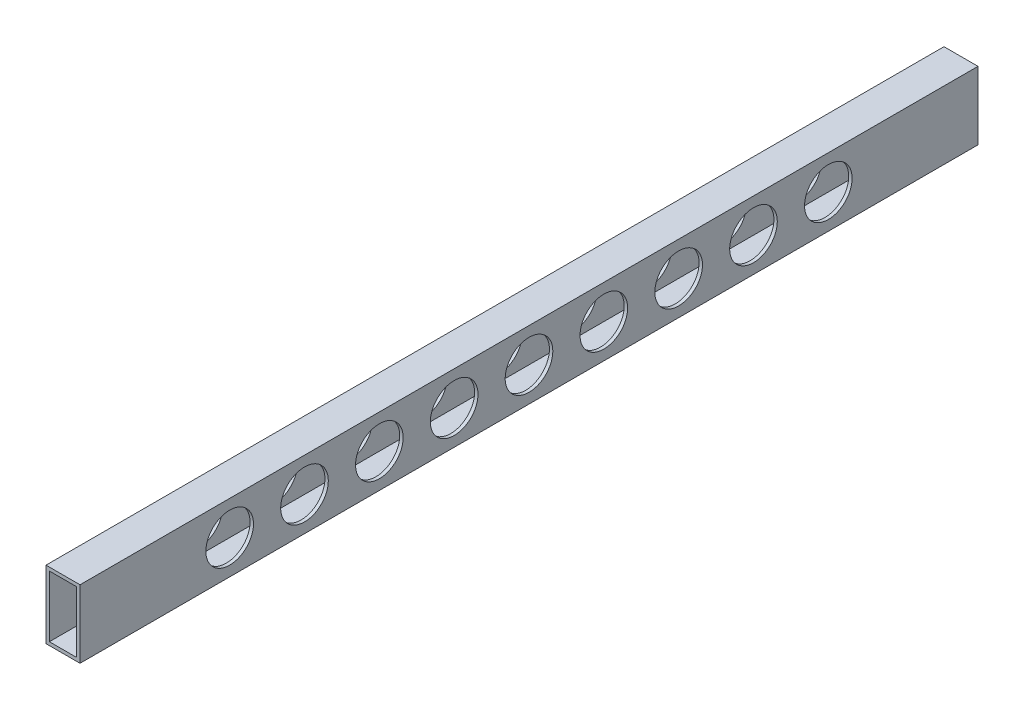
ISO-10303-21;
HEADER;
FILE_DESCRIPTION(('STEP AP214'),'2;1');
FILE_NAME('part.step','',(''),(''),'','','');
FILE_SCHEMA(('AUTOMOTIVE_DESIGN { 1 0 10303 214 1 1 1 1 }'));
ENDSEC;
DATA;
#1=APPLICATION_CONTEXT('core data for automotive mechanical design processes');
#2=APPLICATION_PROTOCOL_DEFINITION('international standard','automotive_design',2000,#1);
#3=PRODUCT_CONTEXT('',#1,'mechanical');
#4=PRODUCT('Part','Part','',(#3));
#5=PRODUCT_RELATED_PRODUCT_CATEGORY('part','',(#4));
#6=PRODUCT_DEFINITION_FORMATION('','',#4);
#7=PRODUCT_DEFINITION_CONTEXT('part definition',#1,'design');
#8=PRODUCT_DEFINITION('design','',#6,#7);
#9=PRODUCT_DEFINITION_SHAPE('','',#8);
#10=(LENGTH_UNIT() NAMED_UNIT(*) SI_UNIT(.MILLI.,.METRE.));
#11=(NAMED_UNIT(*) PLANE_ANGLE_UNIT() SI_UNIT($,.RADIAN.));
#12=(NAMED_UNIT(*) SI_UNIT($,.STERADIAN.) SOLID_ANGLE_UNIT());
#13=UNCERTAINTY_MEASURE_WITH_UNIT(LENGTH_MEASURE(1.E-05),#10,'distance_accuracy_value','');
#14=(GEOMETRIC_REPRESENTATION_CONTEXT(3) GLOBAL_UNCERTAINTY_ASSIGNED_CONTEXT((#13)) GLOBAL_UNIT_ASSIGNED_CONTEXT((#10,
#11,#12)) REPRESENTATION_CONTEXT('',''));
#15=CARTESIAN_POINT('',(0.,0.,0.));
#16=DIRECTION('',(0.,0.,1.));
#17=DIRECTION('',(1.,0.,0.));
#18=AXIS2_PLACEMENT_3D('',#15,#16,#17);
#19=CARTESIAN_POINT('',(0.,0.,838.2));
#20=DIRECTION('',(0.,0.,-1.));
#21=DIRECTION('',(-1.,0.,0.));
#22=AXIS2_PLACEMENT_3D('',#19,#20,#21);
#23=PLANE('',#22);
#24=DIRECTION('',(0.,-1.,0.));
#25=VECTOR('',#24,1.);
#26=CARTESIAN_POINT('',(0.,0.,838.2));
#27=LINE('',#26,#25);
#28=CARTESIAN_POINT('',(0.,63.5,838.2));
#29=VERTEX_POINT('',#28);
#30=CARTESIAN_POINT('',(0.,0.,838.2));
#31=VERTEX_POINT('',#30);
#32=EDGE_CURVE('E138',#29,#31,#27,.T.);
#33=ORIENTED_EDGE('',*,*,#32,.T.);
#34=DIRECTION('',(1.,0.,0.));
#35=VECTOR('',#34,1.);
#36=CARTESIAN_POINT('',(0.,0.,838.2));
#37=LINE('',#36,#35);
#38=CARTESIAN_POINT('',(31.75,0.,838.2));
#39=VERTEX_POINT('',#38);
#40=EDGE_CURVE('E141',#31,#39,#37,.T.);
#41=ORIENTED_EDGE('',*,*,#40,.T.);
#42=DIRECTION('',(0.,1.,0.));
#43=VECTOR('',#42,1.);
#44=CARTESIAN_POINT('',(31.75,0.,838.2));
#45=LINE('',#44,#43);
#46=CARTESIAN_POINT('',(31.75,63.5,838.2));
#47=VERTEX_POINT('',#46);
#48=EDGE_CURVE('E144',#39,#47,#45,.T.);
#49=ORIENTED_EDGE('',*,*,#48,.T.);
#50=DIRECTION('',(-1.,0.,0.));
#51=VECTOR('',#50,1.);
#52=CARTESIAN_POINT('',(0.,63.5,838.2));
#53=LINE('',#52,#51);
#54=EDGE_CURVE('E146',#47,#29,#53,.T.);
#55=ORIENTED_EDGE('',*,*,#54,.T.);
#56=EDGE_LOOP('',(#33,#41,#49,#55));
#57=FACE_BOUND('',#56,.T.);
#58=DIRECTION('',(0.,-1.,0.));
#59=VECTOR('',#58,1.);
#60=CARTESIAN_POINT('',(3.175,3.175,838.2));
#61=LINE('',#60,#59);
#62=CARTESIAN_POINT('',(3.175,60.325,838.2));
#63=VERTEX_POINT('',#62);
#64=CARTESIAN_POINT('',(3.175,3.175,838.2));
#65=VERTEX_POINT('',#64);
#66=EDGE_CURVE('E100',#63,#65,#61,.T.);
#67=ORIENTED_EDGE('',*,*,#66,.F.);
#68=DIRECTION('',(-1.,0.,0.));
#69=VECTOR('',#68,1.);
#70=CARTESIAN_POINT('',(3.175,60.325,838.2));
#71=LINE('',#70,#69);
#72=CARTESIAN_POINT('',(28.575,60.325,838.2));
#73=VERTEX_POINT('',#72);
#74=EDGE_CURVE('E122',#73,#63,#71,.T.);
#75=ORIENTED_EDGE('',*,*,#74,.F.);
#76=DIRECTION('',(0.,1.,0.));
#77=VECTOR('',#76,1.);
#78=CARTESIAN_POINT('',(28.575,3.175,838.2));
#79=LINE('',#78,#77);
#80=CARTESIAN_POINT('',(28.575,3.175,838.2));
#81=VERTEX_POINT('',#80);
#82=EDGE_CURVE('E120',#81,#73,#79,.T.);
#83=ORIENTED_EDGE('',*,*,#82,.F.);
#84=DIRECTION('',(1.,0.,0.));
#85=VECTOR('',#84,1.);
#86=CARTESIAN_POINT('',(3.175,3.175,838.2));
#87=LINE('',#86,#85);
#88=EDGE_CURVE('E108',#65,#81,#87,.T.);
#89=ORIENTED_EDGE('',*,*,#88,.F.);
#90=EDGE_LOOP('',(#67,#75,#83,#89));
#91=FACE_BOUND('',#90,.T.);
#92=ADVANCED_FACE('F33',(#57,#91),#23,.F.);
#93=CARTESIAN_POINT('',(0.,0.,0.));
#94=DIRECTION('',(0.,0.,-1.));
#95=DIRECTION('',(-1.,0.,0.));
#96=AXIS2_PLACEMENT_3D('',#93,#94,#95);
#97=PLANE('',#96);
#98=DIRECTION('',(0.,-1.,0.));
#99=VECTOR('',#98,1.);
#100=CARTESIAN_POINT('',(0.,0.,0.));
#101=LINE('',#100,#99);
#102=CARTESIAN_POINT('',(0.,63.5,0.));
#103=VERTEX_POINT('',#102);
#104=CARTESIAN_POINT('',(0.,0.,0.));
#105=VERTEX_POINT('',#104);
#106=EDGE_CURVE('E116',#103,#105,#101,.T.);
#107=ORIENTED_EDGE('',*,*,#106,.F.);
#108=DIRECTION('',(-1.,0.,0.));
#109=VECTOR('',#108,1.);
#110=CARTESIAN_POINT('',(0.,63.5,0.));
#111=LINE('',#110,#109);
#112=CARTESIAN_POINT('',(31.75,63.5,0.));
#113=VERTEX_POINT('',#112);
#114=EDGE_CURVE('E142',#113,#103,#111,.T.);
#115=ORIENTED_EDGE('',*,*,#114,.F.);
#116=DIRECTION('',(0.,1.,0.));
#117=VECTOR('',#116,1.);
#118=CARTESIAN_POINT('',(31.75,0.,0.));
#119=LINE('',#118,#117);
#120=CARTESIAN_POINT('',(31.75,0.,0.));
#121=VERTEX_POINT('',#120);
#122=EDGE_CURVE('E153',#121,#113,#119,.T.);
#123=ORIENTED_EDGE('',*,*,#122,.F.);
#124=DIRECTION('',(1.,0.,0.));
#125=VECTOR('',#124,1.);
#126=CARTESIAN_POINT('',(0.,0.,0.));
#127=LINE('',#126,#125);
#128=EDGE_CURVE('E151',#105,#121,#127,.T.);
#129=ORIENTED_EDGE('',*,*,#128,.F.);
#130=EDGE_LOOP('',(#107,#115,#123,#129));
#131=FACE_BOUND('',#130,.T.);
#132=DIRECTION('',(-1.,0.,0.));
#133=VECTOR('',#132,1.);
#134=CARTESIAN_POINT('',(3.175,60.325,0.));
#135=LINE('',#134,#133);
#136=CARTESIAN_POINT('',(28.575,60.325,0.));
#137=VERTEX_POINT('',#136);
#138=CARTESIAN_POINT('',(3.175,60.325,0.));
#139=VERTEX_POINT('',#138);
#140=EDGE_CURVE('E109',#137,#139,#135,.T.);
#141=ORIENTED_EDGE('',*,*,#140,.T.);
#142=DIRECTION('',(0.,-1.,0.));
#143=VECTOR('',#142,1.);
#144=CARTESIAN_POINT('',(3.175,3.175,0.));
#145=LINE('',#144,#143);
#146=CARTESIAN_POINT('',(3.175,3.175,0.));
#147=VERTEX_POINT('',#146);
#148=EDGE_CURVE('E58',#139,#147,#145,.T.);
#149=ORIENTED_EDGE('',*,*,#148,.T.);
#150=DIRECTION('',(1.,0.,0.));
#151=VECTOR('',#150,1.);
#152=CARTESIAN_POINT('',(3.175,3.175,0.));
#153=LINE('',#152,#151);
#154=CARTESIAN_POINT('',(28.575,3.175,0.));
#155=VERTEX_POINT('',#154);
#156=EDGE_CURVE('E115',#147,#155,#153,.T.);
#157=ORIENTED_EDGE('',*,*,#156,.T.);
#158=DIRECTION('',(0.,1.,0.));
#159=VECTOR('',#158,1.);
#160=CARTESIAN_POINT('',(28.575,3.175,0.));
#161=LINE('',#160,#159);
#162=EDGE_CURVE('E130',#155,#137,#161,.T.);
#163=ORIENTED_EDGE('',*,*,#162,.T.);
#164=EDGE_LOOP('',(#141,#149,#157,#163));
#165=FACE_BOUND('',#164,.T.);
#166=ADVANCED_FACE('F237',(#131,#165),#97,.T.);
#167=CARTESIAN_POINT('',(0.,0.,838.2));
#168=DIRECTION('',(1.,0.,0.));
#169=DIRECTION('',(0.,0.,-1.));
#170=AXIS2_PLACEMENT_3D('',#167,#168,#169);
#171=PLANE('',#170);
#172=CARTESIAN_POINT('',(0.,31.75,628.65));
#173=DIRECTION('',(1.,0.,0.));
#174=DIRECTION('',(0.,0.,-1.));
#175=AXIS2_PLACEMENT_3D('',#172,#173,#174);
#176=CIRCLE('',#175,22.225);
#177=CARTESIAN_POINT('',(0.,31.75,606.425));
#178=VERTEX_POINT('',#177);
#179=EDGE_CURVE('E171',#178,#178,#176,.T.);
#180=ORIENTED_EDGE('',*,*,#179,.T.);
#181=EDGE_LOOP('',(#180));
#182=FACE_BOUND('',#181,.T.);
#183=CARTESIAN_POINT('',(0.,31.75,558.8));
#184=DIRECTION('',(1.,0.,0.));
#185=DIRECTION('',(0.,0.,-1.));
#186=AXIS2_PLACEMENT_3D('',#183,#184,#185);
#187=CIRCLE('',#186,22.2249999999999);
#188=CARTESIAN_POINT('',(0.,31.75,536.575));
#189=VERTEX_POINT('',#188);
#190=EDGE_CURVE('E338',#189,#189,#187,.T.);
#191=ORIENTED_EDGE('',*,*,#190,.T.);
#192=EDGE_LOOP('',(#191));
#193=FACE_BOUND('',#192,.T.);
#194=CARTESIAN_POINT('',(0.,31.75,488.95));
#195=DIRECTION('',(1.,0.,0.));
#196=DIRECTION('',(0.,0.,-1.));
#197=AXIS2_PLACEMENT_3D('',#194,#195,#196);
#198=CIRCLE('',#197,22.225);
#199=CARTESIAN_POINT('',(0.,31.75,466.725));
#200=VERTEX_POINT('',#199);
#201=EDGE_CURVE('E346',#200,#200,#198,.T.);
#202=ORIENTED_EDGE('',*,*,#201,.T.);
#203=EDGE_LOOP('',(#202));
#204=FACE_BOUND('',#203,.T.);
#205=CARTESIAN_POINT('',(0.,31.75,419.1));
#206=DIRECTION('',(1.,0.,0.));
#207=DIRECTION('',(0.,0.,-1.));
#208=AXIS2_PLACEMENT_3D('',#205,#206,#207);
#209=CIRCLE('',#208,22.225);
#210=CARTESIAN_POINT('',(0.,31.75,396.875));
#211=VERTEX_POINT('',#210);
#212=EDGE_CURVE('E352',#211,#211,#209,.T.);
#213=ORIENTED_EDGE('',*,*,#212,.T.);
#214=EDGE_LOOP('',(#213));
#215=FACE_BOUND('',#214,.T.);
#216=CARTESIAN_POINT('',(0.,31.75,349.25));
#217=DIRECTION('',(1.,0.,0.));
#218=DIRECTION('',(0.,0.,-1.));
#219=AXIS2_PLACEMENT_3D('',#216,#217,#218);
#220=CIRCLE('',#219,22.225);
#221=CARTESIAN_POINT('',(0.,31.75,327.025));
#222=VERTEX_POINT('',#221);
#223=EDGE_CURVE('E358',#222,#222,#220,.T.);
#224=ORIENTED_EDGE('',*,*,#223,.T.);
#225=EDGE_LOOP('',(#224));
#226=FACE_BOUND('',#225,.T.);
#227=CARTESIAN_POINT('',(0.,31.75,279.4));
#228=DIRECTION('',(1.,0.,0.));
#229=DIRECTION('',(0.,0.,-1.));
#230=AXIS2_PLACEMENT_3D('',#227,#228,#229);
#231=CIRCLE('',#230,22.225);
#232=CARTESIAN_POINT('',(0.,31.75,257.175));
#233=VERTEX_POINT('',#232);
#234=EDGE_CURVE('E364',#233,#233,#231,.T.);
#235=ORIENTED_EDGE('',*,*,#234,.T.);
#236=EDGE_LOOP('',(#235));
#237=FACE_BOUND('',#236,.T.);
#238=CARTESIAN_POINT('',(0.,31.75,209.55));
#239=DIRECTION('',(1.,0.,0.));
#240=DIRECTION('',(0.,0.,-1.));
#241=AXIS2_PLACEMENT_3D('',#238,#239,#240);
#242=CIRCLE('',#241,22.225);
#243=CARTESIAN_POINT('',(0.,31.75,187.325));
#244=VERTEX_POINT('',#243);
#245=EDGE_CURVE('E370',#244,#244,#242,.T.);
#246=ORIENTED_EDGE('',*,*,#245,.T.);
#247=EDGE_LOOP('',(#246));
#248=FACE_BOUND('',#247,.T.);
#249=CARTESIAN_POINT('',(0.,31.75,139.7));
#250=DIRECTION('',(1.,0.,0.));
#251=DIRECTION('',(0.,0.,-1.));
#252=AXIS2_PLACEMENT_3D('',#249,#250,#251);
#253=CIRCLE('',#252,22.225);
#254=CARTESIAN_POINT('',(0.,31.75,117.475));
#255=VERTEX_POINT('',#254);
#256=EDGE_CURVE('E376',#255,#255,#253,.T.);
#257=ORIENTED_EDGE('',*,*,#256,.T.);
#258=EDGE_LOOP('',(#257));
#259=FACE_BOUND('',#258,.T.);
#260=CARTESIAN_POINT('',(0.,31.75,698.5));
#261=DIRECTION('',(1.,0.,0.));
#262=DIRECTION('',(0.,0.,-1.));
#263=AXIS2_PLACEMENT_3D('',#260,#261,#262);
#264=CIRCLE('',#263,22.225);
#265=CARTESIAN_POINT('',(0.,31.75,676.275));
#266=VERTEX_POINT('',#265);
#267=EDGE_CURVE('E166',#266,#266,#264,.T.);
#268=ORIENTED_EDGE('',*,*,#267,.T.);
#269=EDGE_LOOP('',(#268));
#270=FACE_BOUND('',#269,.T.);
#271=ORIENTED_EDGE('',*,*,#106,.T.);
#272=DIRECTION('',(0.,0.,-1.));
#273=VECTOR('',#272,1.);
#274=CARTESIAN_POINT('',(0.,0.,838.2));
#275=LINE('',#274,#273);
#276=EDGE_CURVE('E11',#31,#105,#275,.T.);
#277=ORIENTED_EDGE('',*,*,#276,.F.);
#278=ORIENTED_EDGE('',*,*,#32,.F.);
#279=DIRECTION('',(0.,0.,-1.));
#280=VECTOR('',#279,1.);
#281=CARTESIAN_POINT('',(0.,63.5,838.2));
#282=LINE('',#281,#280);
#283=EDGE_CURVE('E148',#29,#103,#282,.T.);
#284=ORIENTED_EDGE('',*,*,#283,.T.);
#285=EDGE_LOOP('',(#271,#277,#278,#284));
#286=FACE_BOUND('',#285,.T.);
#287=ADVANCED_FACE('F35',(#182,#193,#204,#215,#226,#237,#248,#259,#270,#286),#171,.F.);
#288=CARTESIAN_POINT('',(0.,0.,838.2));
#289=DIRECTION('',(0.,1.,0.));
#290=DIRECTION('',(0.,0.,1.));
#291=AXIS2_PLACEMENT_3D('',#288,#289,#290);
#292=PLANE('',#291);
#293=ORIENTED_EDGE('',*,*,#128,.T.);
#294=DIRECTION('',(0.,0.,-1.));
#295=VECTOR('',#294,1.);
#296=CARTESIAN_POINT('',(31.75,0.,838.2));
#297=LINE('',#296,#295);
#298=EDGE_CURVE('E42',#39,#121,#297,.T.);
#299=ORIENTED_EDGE('',*,*,#298,.F.);
#300=ORIENTED_EDGE('',*,*,#40,.F.);
#301=ORIENTED_EDGE('',*,*,#276,.T.);
#302=EDGE_LOOP('',(#293,#299,#300,#301));
#303=FACE_BOUND('',#302,.T.);
#304=ADVANCED_FACE('F245',(#303),#292,.F.);
#305=CARTESIAN_POINT('',(31.75,0.,838.2));
#306=DIRECTION('',(-1.,0.,0.));
#307=DIRECTION('',(0.,0.,1.));
#308=AXIS2_PLACEMENT_3D('',#305,#306,#307);
#309=PLANE('',#308);
#310=CARTESIAN_POINT('',(31.75,31.75,628.65));
#311=DIRECTION('',(1.,0.,0.));
#312=DIRECTION('',(0.,0.,-1.));
#313=AXIS2_PLACEMENT_3D('',#310,#311,#312);
#314=CIRCLE('',#313,22.225);
#315=CARTESIAN_POINT('',(31.75,31.75,606.425));
#316=VERTEX_POINT('',#315);
#317=EDGE_CURVE('E335',#316,#316,#314,.T.);
#318=ORIENTED_EDGE('',*,*,#317,.F.);
#319=EDGE_LOOP('',(#318));
#320=FACE_BOUND('',#319,.T.);
#321=CARTESIAN_POINT('',(31.75,31.75,558.8));
#322=DIRECTION('',(1.,0.,0.));
#323=DIRECTION('',(0.,0.,-1.));
#324=AXIS2_PLACEMENT_3D('',#321,#322,#323);
#325=CIRCLE('',#324,22.2249999999999);
#326=CARTESIAN_POINT('',(31.75,31.75,536.575));
#327=VERTEX_POINT('',#326);
#328=EDGE_CURVE('E343',#327,#327,#325,.T.);
#329=ORIENTED_EDGE('',*,*,#328,.F.);
#330=EDGE_LOOP('',(#329));
#331=FACE_BOUND('',#330,.T.);
#332=CARTESIAN_POINT('',(31.75,31.75,488.95));
#333=DIRECTION('',(1.,0.,0.));
#334=DIRECTION('',(0.,0.,-1.));
#335=AXIS2_PLACEMENT_3D('',#332,#333,#334);
#336=CIRCLE('',#335,22.225);
#337=CARTESIAN_POINT('',(31.75,31.75,466.725));
#338=VERTEX_POINT('',#337);
#339=EDGE_CURVE('E349',#338,#338,#336,.T.);
#340=ORIENTED_EDGE('',*,*,#339,.F.);
#341=EDGE_LOOP('',(#340));
#342=FACE_BOUND('',#341,.T.);
#343=CARTESIAN_POINT('',(31.75,31.75,419.1));
#344=DIRECTION('',(1.,0.,0.));
#345=DIRECTION('',(0.,0.,-1.));
#346=AXIS2_PLACEMENT_3D('',#343,#344,#345);
#347=CIRCLE('',#346,22.225);
#348=CARTESIAN_POINT('',(31.75,31.75,396.875));
#349=VERTEX_POINT('',#348);
#350=EDGE_CURVE('E355',#349,#349,#347,.T.);
#351=ORIENTED_EDGE('',*,*,#350,.F.);
#352=EDGE_LOOP('',(#351));
#353=FACE_BOUND('',#352,.T.);
#354=CARTESIAN_POINT('',(31.75,31.75,349.25));
#355=DIRECTION('',(1.,0.,0.));
#356=DIRECTION('',(0.,0.,-1.));
#357=AXIS2_PLACEMENT_3D('',#354,#355,#356);
#358=CIRCLE('',#357,22.225);
#359=CARTESIAN_POINT('',(31.75,31.75,327.025));
#360=VERTEX_POINT('',#359);
#361=EDGE_CURVE('E361',#360,#360,#358,.T.);
#362=ORIENTED_EDGE('',*,*,#361,.F.);
#363=EDGE_LOOP('',(#362));
#364=FACE_BOUND('',#363,.T.);
#365=CARTESIAN_POINT('',(31.75,31.75,279.4));
#366=DIRECTION('',(1.,0.,0.));
#367=DIRECTION('',(0.,0.,-1.));
#368=AXIS2_PLACEMENT_3D('',#365,#366,#367);
#369=CIRCLE('',#368,22.225);
#370=CARTESIAN_POINT('',(31.75,31.75,257.175));
#371=VERTEX_POINT('',#370);
#372=EDGE_CURVE('E367',#371,#371,#369,.T.);
#373=ORIENTED_EDGE('',*,*,#372,.F.);
#374=EDGE_LOOP('',(#373));
#375=FACE_BOUND('',#374,.T.);
#376=CARTESIAN_POINT('',(31.75,31.75,209.55));
#377=DIRECTION('',(1.,0.,0.));
#378=DIRECTION('',(0.,0.,-1.));
#379=AXIS2_PLACEMENT_3D('',#376,#377,#378);
#380=CIRCLE('',#379,22.225);
#381=CARTESIAN_POINT('',(31.75,31.75,187.325));
#382=VERTEX_POINT('',#381);
#383=EDGE_CURVE('E373',#382,#382,#380,.T.);
#384=ORIENTED_EDGE('',*,*,#383,.F.);
#385=EDGE_LOOP('',(#384));
#386=FACE_BOUND('',#385,.T.);
#387=CARTESIAN_POINT('',(31.75,31.75,139.7));
#388=DIRECTION('',(1.,0.,0.));
#389=DIRECTION('',(0.,0.,-1.));
#390=AXIS2_PLACEMENT_3D('',#387,#388,#389);
#391=CIRCLE('',#390,22.225);
#392=CARTESIAN_POINT('',(31.75,31.75,117.475));
#393=VERTEX_POINT('',#392);
#394=EDGE_CURVE('E379',#393,#393,#391,.T.);
#395=ORIENTED_EDGE('',*,*,#394,.F.);
#396=EDGE_LOOP('',(#395));
#397=FACE_BOUND('',#396,.T.);
#398=CARTESIAN_POINT('',(31.75,31.75,698.5));
#399=DIRECTION('',(1.,0.,0.));
#400=DIRECTION('',(0.,0.,-1.));
#401=AXIS2_PLACEMENT_3D('',#398,#399,#400);
#402=CIRCLE('',#401,22.225);
#403=CARTESIAN_POINT('',(31.75,31.75,676.275));
#404=VERTEX_POINT('',#403);
#405=EDGE_CURVE('E208',#404,#404,#402,.T.);
#406=ORIENTED_EDGE('',*,*,#405,.F.);
#407=EDGE_LOOP('',(#406));
#408=FACE_BOUND('',#407,.T.);
#409=ORIENTED_EDGE('',*,*,#122,.T.);
#410=DIRECTION('',(0.,0.,-1.));
#411=VECTOR('',#410,1.);
#412=CARTESIAN_POINT('',(31.75,63.5,838.2));
#413=LINE('',#412,#411);
#414=EDGE_CURVE('E158',#47,#113,#413,.T.);
#415=ORIENTED_EDGE('',*,*,#414,.F.);
#416=ORIENTED_EDGE('',*,*,#48,.F.);
#417=ORIENTED_EDGE('',*,*,#298,.T.);
#418=EDGE_LOOP('',(#409,#415,#416,#417));
#419=FACE_BOUND('',#418,.T.);
#420=ADVANCED_FACE('F230',(#320,#331,#342,#353,#364,#375,#386,#397,#408,#419),#309,.F.);
#421=CARTESIAN_POINT('',(0.,63.5,838.2));
#422=DIRECTION('',(0.,-1.,0.));
#423=DIRECTION('',(0.,0.,-1.));
#424=AXIS2_PLACEMENT_3D('',#421,#422,#423);
#425=PLANE('',#424);
#426=ORIENTED_EDGE('',*,*,#114,.T.);
#427=ORIENTED_EDGE('',*,*,#283,.F.);
#428=ORIENTED_EDGE('',*,*,#54,.F.);
#429=ORIENTED_EDGE('',*,*,#414,.T.);
#430=EDGE_LOOP('',(#426,#427,#428,#429));
#431=FACE_BOUND('',#430,.T.);
#432=ADVANCED_FACE('F219',(#431),#425,.F.);
#433=CARTESIAN_POINT('',(3.175,3.175,838.2));
#434=DIRECTION('',(1.,0.,0.));
#435=DIRECTION('',(0.,0.,-1.));
#436=AXIS2_PLACEMENT_3D('',#433,#434,#435);
#437=PLANE('',#436);
#438=CARTESIAN_POINT('',(3.175,31.75,628.65));
#439=DIRECTION('',(1.,0.,0.));
#440=DIRECTION('',(0.,0.,-1.));
#441=AXIS2_PLACEMENT_3D('',#438,#439,#440);
#442=CIRCLE('',#441,22.225);
#443=CARTESIAN_POINT('',(3.175,31.75,606.425));
#444=VERTEX_POINT('',#443);
#445=EDGE_CURVE('E205',#444,#444,#442,.T.);
#446=ORIENTED_EDGE('',*,*,#445,.F.);
#447=EDGE_LOOP('',(#446));
#448=FACE_BOUND('',#447,.T.);
#449=CARTESIAN_POINT('',(3.175,31.75,558.8));
#450=DIRECTION('',(1.,0.,0.));
#451=DIRECTION('',(0.,0.,-1.));
#452=AXIS2_PLACEMENT_3D('',#449,#450,#451);
#453=CIRCLE('',#452,22.2249999999999);
#454=CARTESIAN_POINT('',(3.175,31.75,536.575));
#455=VERTEX_POINT('',#454);
#456=EDGE_CURVE('E193',#455,#455,#453,.T.);
#457=ORIENTED_EDGE('',*,*,#456,.F.);
#458=EDGE_LOOP('',(#457));
#459=FACE_BOUND('',#458,.T.);
#460=CARTESIAN_POINT('',(3.175,31.75,488.95));
#461=DIRECTION('',(1.,0.,0.));
#462=DIRECTION('',(0.,0.,-1.));
#463=AXIS2_PLACEMENT_3D('',#460,#461,#462);
#464=CIRCLE('',#463,22.225);
#465=CARTESIAN_POINT('',(3.175,31.75,466.725));
#466=VERTEX_POINT('',#465);
#467=EDGE_CURVE('E190',#466,#466,#464,.T.);
#468=ORIENTED_EDGE('',*,*,#467,.F.);
#469=EDGE_LOOP('',(#468));
#470=FACE_BOUND('',#469,.T.);
#471=CARTESIAN_POINT('',(3.175,31.75,419.1));
#472=DIRECTION('',(1.,0.,0.));
#473=DIRECTION('',(0.,0.,-1.));
#474=AXIS2_PLACEMENT_3D('',#471,#472,#473);
#475=CIRCLE('',#474,22.225);
#476=CARTESIAN_POINT('',(3.175,31.75,396.875));
#477=VERTEX_POINT('',#476);
#478=EDGE_CURVE('E187',#477,#477,#475,.T.);
#479=ORIENTED_EDGE('',*,*,#478,.F.);
#480=EDGE_LOOP('',(#479));
#481=FACE_BOUND('',#480,.T.);
#482=CARTESIAN_POINT('',(3.175,31.75,349.25));
#483=DIRECTION('',(1.,0.,0.));
#484=DIRECTION('',(0.,0.,-1.));
#485=AXIS2_PLACEMENT_3D('',#482,#483,#484);
#486=CIRCLE('',#485,22.225);
#487=CARTESIAN_POINT('',(3.175,31.75,327.025));
#488=VERTEX_POINT('',#487);
#489=EDGE_CURVE('E183',#488,#488,#486,.T.);
#490=ORIENTED_EDGE('',*,*,#489,.F.);
#491=EDGE_LOOP('',(#490));
#492=FACE_BOUND('',#491,.T.);
#493=CARTESIAN_POINT('',(3.175,31.75,279.4));
#494=DIRECTION('',(1.,0.,0.));
#495=DIRECTION('',(0.,0.,-1.));
#496=AXIS2_PLACEMENT_3D('',#493,#494,#495);
#497=CIRCLE('',#496,22.225);
#498=CARTESIAN_POINT('',(3.175,31.75,257.175));
#499=VERTEX_POINT('',#498);
#500=EDGE_CURVE('E179',#499,#499,#497,.T.);
#501=ORIENTED_EDGE('',*,*,#500,.F.);
#502=EDGE_LOOP('',(#501));
#503=FACE_BOUND('',#502,.T.);
#504=CARTESIAN_POINT('',(3.175,31.75,209.55));
#505=DIRECTION('',(1.,0.,0.));
#506=DIRECTION('',(0.,0.,-1.));
#507=AXIS2_PLACEMENT_3D('',#504,#505,#506);
#508=CIRCLE('',#507,22.225);
#509=CARTESIAN_POINT('',(3.175,31.75,187.325));
#510=VERTEX_POINT('',#509);
#511=EDGE_CURVE('E175',#510,#510,#508,.T.);
#512=ORIENTED_EDGE('',*,*,#511,.F.);
#513=EDGE_LOOP('',(#512));
#514=FACE_BOUND('',#513,.T.);
#515=CARTESIAN_POINT('',(3.175,31.75,139.7));
#516=DIRECTION('',(1.,0.,0.));
#517=DIRECTION('',(0.,0.,-1.));
#518=AXIS2_PLACEMENT_3D('',#515,#516,#517);
#519=CIRCLE('',#518,22.225);
#520=CARTESIAN_POINT('',(3.175,31.75,117.475));
#521=VERTEX_POINT('',#520);
#522=EDGE_CURVE('E170',#521,#521,#519,.T.);
#523=ORIENTED_EDGE('',*,*,#522,.F.);
#524=EDGE_LOOP('',(#523));
#525=FACE_BOUND('',#524,.T.);
#526=CARTESIAN_POINT('',(3.175,31.75,698.5));
#527=DIRECTION('',(1.,0.,0.));
#528=DIRECTION('',(0.,0.,-1.));
#529=AXIS2_PLACEMENT_3D('',#526,#527,#528);
#530=CIRCLE('',#529,22.225);
#531=CARTESIAN_POINT('',(3.175,31.75,676.275));
#532=VERTEX_POINT('',#531);
#533=EDGE_CURVE('E128',#532,#532,#530,.T.);
#534=ORIENTED_EDGE('',*,*,#533,.F.);
#535=EDGE_LOOP('',(#534));
#536=FACE_BOUND('',#535,.T.);
#537=ORIENTED_EDGE('',*,*,#148,.F.);
#538=DIRECTION('',(0.,0.,-1.));
#539=VECTOR('',#538,1.);
#540=CARTESIAN_POINT('',(3.175,60.325,838.2));
#541=LINE('',#540,#539);
#542=EDGE_CURVE('E104',#63,#139,#541,.T.);
#543=ORIENTED_EDGE('',*,*,#542,.F.);
#544=ORIENTED_EDGE('',*,*,#66,.T.);
#545=DIRECTION('',(0.,0.,-1.));
#546=VECTOR('',#545,1.);
#547=CARTESIAN_POINT('',(3.175,3.175,838.2));
#548=LINE('',#547,#546);
#549=EDGE_CURVE('E103',#65,#147,#548,.T.);
#550=ORIENTED_EDGE('',*,*,#549,.T.);
#551=EDGE_LOOP('',(#537,#543,#544,#550));
#552=FACE_BOUND('',#551,.T.);
#553=ADVANCED_FACE('F102',(#448,#459,#470,#481,#492,#503,#514,#525,#536,#552),#437,.T.);
#554=CARTESIAN_POINT('',(3.175,3.175,838.2));
#555=DIRECTION('',(0.,1.,0.));
#556=DIRECTION('',(0.,0.,1.));
#557=AXIS2_PLACEMENT_3D('',#554,#555,#556);
#558=PLANE('',#557);
#559=ORIENTED_EDGE('',*,*,#156,.F.);
#560=ORIENTED_EDGE('',*,*,#549,.F.);
#561=ORIENTED_EDGE('',*,*,#88,.T.);
#562=DIRECTION('',(0.,0.,-1.));
#563=VECTOR('',#562,1.);
#564=CARTESIAN_POINT('',(28.575,3.175,838.2));
#565=LINE('',#564,#563);
#566=EDGE_CURVE('E117',#81,#155,#565,.T.);
#567=ORIENTED_EDGE('',*,*,#566,.T.);
#568=EDGE_LOOP('',(#559,#560,#561,#567));
#569=FACE_BOUND('',#568,.T.);
#570=ADVANCED_FACE('F112',(#569),#558,.T.);
#571=CARTESIAN_POINT('',(28.575,3.175,838.2));
#572=DIRECTION('',(-1.,0.,0.));
#573=DIRECTION('',(0.,-1.,0.));
#574=AXIS2_PLACEMENT_3D('',#571,#572,#573);
#575=PLANE('',#574);
#576=CARTESIAN_POINT('',(28.575,31.75,628.65));
#577=DIRECTION('',(-1.,0.,0.));
#578=DIRECTION('',(0.,-1.,0.));
#579=AXIS2_PLACEMENT_3D('',#576,#577,#578);
#580=CIRCLE('',#579,22.225);
#581=CARTESIAN_POINT('',(28.575,9.52499999999998,628.65));
#582=VERTEX_POINT('',#581);
#583=EDGE_CURVE('E37',#582,#582,#580,.T.);
#584=ORIENTED_EDGE('',*,*,#583,.F.);
#585=EDGE_LOOP('',(#584));
#586=FACE_BOUND('',#585,.T.);
#587=CARTESIAN_POINT('',(28.575,31.75,558.8));
#588=DIRECTION('',(-1.,0.,0.));
#589=DIRECTION('',(0.,-1.,0.));
#590=AXIS2_PLACEMENT_3D('',#587,#588,#589);
#591=CIRCLE('',#590,22.2249999999999);
#592=CARTESIAN_POINT('',(28.575,9.5250000000001,558.8));
#593=VERTEX_POINT('',#592);
#594=EDGE_CURVE('E191',#593,#593,#591,.T.);
#595=ORIENTED_EDGE('',*,*,#594,.F.);
#596=EDGE_LOOP('',(#595));
#597=FACE_BOUND('',#596,.T.);
#598=CARTESIAN_POINT('',(28.575,31.75,488.95));
#599=DIRECTION('',(-1.,0.,0.));
#600=DIRECTION('',(0.,-1.,0.));
#601=AXIS2_PLACEMENT_3D('',#598,#599,#600);
#602=CIRCLE('',#601,22.225);
#603=CARTESIAN_POINT('',(28.575,9.52499999999999,488.95));
#604=VERTEX_POINT('',#603);
#605=EDGE_CURVE('E188',#604,#604,#602,.T.);
#606=ORIENTED_EDGE('',*,*,#605,.F.);
#607=EDGE_LOOP('',(#606));
#608=FACE_BOUND('',#607,.T.);
#609=CARTESIAN_POINT('',(28.575,31.75,419.1));
#610=DIRECTION('',(-1.,0.,0.));
#611=DIRECTION('',(0.,-1.,0.));
#612=AXIS2_PLACEMENT_3D('',#609,#610,#611);
#613=CIRCLE('',#612,22.225);
#614=CARTESIAN_POINT('',(28.575,9.52499999999999,419.1));
#615=VERTEX_POINT('',#614);
#616=EDGE_CURVE('E184',#615,#615,#613,.T.);
#617=ORIENTED_EDGE('',*,*,#616,.F.);
#618=EDGE_LOOP('',(#617));
#619=FACE_BOUND('',#618,.T.);
#620=CARTESIAN_POINT('',(28.575,31.75,349.25));
#621=DIRECTION('',(-1.,0.,0.));
#622=DIRECTION('',(0.,-1.,0.));
#623=AXIS2_PLACEMENT_3D('',#620,#621,#622);
#624=CIRCLE('',#623,22.225);
#625=CARTESIAN_POINT('',(28.575,9.52499999999999,349.25));
#626=VERTEX_POINT('',#625);
#627=EDGE_CURVE('E180',#626,#626,#624,.T.);
#628=ORIENTED_EDGE('',*,*,#627,.F.);
#629=EDGE_LOOP('',(#628));
#630=FACE_BOUND('',#629,.T.);
#631=CARTESIAN_POINT('',(28.575,31.75,279.4));
#632=DIRECTION('',(-1.,0.,0.));
#633=DIRECTION('',(0.,-1.,0.));
#634=AXIS2_PLACEMENT_3D('',#631,#632,#633);
#635=CIRCLE('',#634,22.225);
#636=CARTESIAN_POINT('',(28.575,9.52499999999999,279.4));
#637=VERTEX_POINT('',#636);
#638=EDGE_CURVE('E176',#637,#637,#635,.T.);
#639=ORIENTED_EDGE('',*,*,#638,.F.);
#640=EDGE_LOOP('',(#639));
#641=FACE_BOUND('',#640,.T.);
#642=CARTESIAN_POINT('',(28.575,31.75,209.55));
#643=DIRECTION('',(-1.,0.,0.));
#644=DIRECTION('',(0.,-1.,0.));
#645=AXIS2_PLACEMENT_3D('',#642,#643,#644);
#646=CIRCLE('',#645,22.225);
#647=CARTESIAN_POINT('',(28.575,9.52499999999999,209.55));
#648=VERTEX_POINT('',#647);
#649=EDGE_CURVE('E172',#648,#648,#646,.T.);
#650=ORIENTED_EDGE('',*,*,#649,.F.);
#651=EDGE_LOOP('',(#650));
#652=FACE_BOUND('',#651,.T.);
#653=CARTESIAN_POINT('',(28.575,31.75,139.7));
#654=DIRECTION('',(-1.,0.,0.));
#655=DIRECTION('',(0.,-1.,0.));
#656=AXIS2_PLACEMENT_3D('',#653,#654,#655);
#657=CIRCLE('',#656,22.225);
#658=CARTESIAN_POINT('',(28.575,9.52499999999997,139.7));
#659=VERTEX_POINT('',#658);
#660=EDGE_CURVE('E167',#659,#659,#657,.T.);
#661=ORIENTED_EDGE('',*,*,#660,.F.);
#662=EDGE_LOOP('',(#661));
#663=FACE_BOUND('',#662,.T.);
#664=CARTESIAN_POINT('',(28.575,31.75,698.5));
#665=DIRECTION('',(-1.,0.,0.));
#666=DIRECTION('',(0.,-1.,0.));
#667=AXIS2_PLACEMENT_3D('',#664,#665,#666);
#668=CIRCLE('',#667,22.225);
#669=CARTESIAN_POINT('',(28.575,9.52499999999998,698.5));
#670=VERTEX_POINT('',#669);
#671=EDGE_CURVE('E163',#670,#670,#668,.T.);
#672=ORIENTED_EDGE('',*,*,#671,.F.);
#673=EDGE_LOOP('',(#672));
#674=FACE_BOUND('',#673,.T.);
#675=ORIENTED_EDGE('',*,*,#162,.F.);
#676=ORIENTED_EDGE('',*,*,#566,.F.);
#677=ORIENTED_EDGE('',*,*,#82,.T.);
#678=DIRECTION('',(0.,0.,-1.));
#679=VECTOR('',#678,1.);
#680=CARTESIAN_POINT('',(28.575,60.325,838.2));
#681=LINE('',#680,#679);
#682=EDGE_CURVE('E50',#73,#137,#681,.T.);
#683=ORIENTED_EDGE('',*,*,#682,.T.);
#684=EDGE_LOOP('',(#675,#676,#677,#683));
#685=FACE_BOUND('',#684,.T.);
#686=ADVANCED_FACE('F227',(#586,#597,#608,#619,#630,#641,#652,#663,#674,#685),#575,.T.);
#687=CARTESIAN_POINT('',(3.175,60.325,838.2));
#688=DIRECTION('',(0.,-1.,0.));
#689=DIRECTION('',(0.,0.,-1.));
#690=AXIS2_PLACEMENT_3D('',#687,#688,#689);
#691=PLANE('',#690);
#692=ORIENTED_EDGE('',*,*,#140,.F.);
#693=ORIENTED_EDGE('',*,*,#682,.F.);
#694=ORIENTED_EDGE('',*,*,#74,.T.);
#695=ORIENTED_EDGE('',*,*,#542,.T.);
#696=EDGE_LOOP('',(#692,#693,#694,#695));
#697=FACE_BOUND('',#696,.T.);
#698=ADVANCED_FACE('F269',(#697),#691,.T.);
#699=CARTESIAN_POINT('',(0.,31.75,698.5));
#700=DIRECTION('',(1.,0.,0.));
#701=DIRECTION('',(0.,0.,-1.));
#702=AXIS2_PLACEMENT_3D('',#699,#700,#701);
#703=CYLINDRICAL_SURFACE('',#702,22.225);
#704=ORIENTED_EDGE('',*,*,#671,.T.);
#705=EDGE_LOOP('',(#704));
#706=FACE_BOUND('',#705,.T.);
#707=ORIENTED_EDGE('',*,*,#405,.T.);
#708=EDGE_LOOP('',(#707));
#709=FACE_BOUND('',#708,.T.);
#710=ADVANCED_FACE('F271',(#706,#709),#703,.F.);
#711=ORIENTED_EDGE('',*,*,#533,.T.);
#712=EDGE_LOOP('',(#711));
#713=FACE_BOUND('',#712,.T.);
#714=ORIENTED_EDGE('',*,*,#267,.F.);
#715=EDGE_LOOP('',(#714));
#716=FACE_BOUND('',#715,.T.);
#717=ADVANCED_FACE('F215',(#713,#716),#703,.F.);
#718=CARTESIAN_POINT('',(0.,31.75,139.7));
#719=DIRECTION('',(1.,0.,0.));
#720=DIRECTION('',(0.,0.,-1.));
#721=AXIS2_PLACEMENT_3D('',#718,#719,#720);
#722=CYLINDRICAL_SURFACE('',#721,22.225);
#723=ORIENTED_EDGE('',*,*,#660,.T.);
#724=EDGE_LOOP('',(#723));
#725=FACE_BOUND('',#724,.T.);
#726=ORIENTED_EDGE('',*,*,#394,.T.);
#727=EDGE_LOOP('',(#726));
#728=FACE_BOUND('',#727,.T.);
#729=ADVANCED_FACE('F282',(#725,#728),#722,.F.);
#730=CARTESIAN_POINT('',(0.,31.75,209.55));
#731=DIRECTION('',(1.,0.,0.));
#732=DIRECTION('',(0.,0.,-1.));
#733=AXIS2_PLACEMENT_3D('',#730,#731,#732);
#734=CYLINDRICAL_SURFACE('',#733,22.225);
#735=ORIENTED_EDGE('',*,*,#649,.T.);
#736=EDGE_LOOP('',(#735));
#737=FACE_BOUND('',#736,.T.);
#738=ORIENTED_EDGE('',*,*,#383,.T.);
#739=EDGE_LOOP('',(#738));
#740=FACE_BOUND('',#739,.T.);
#741=ADVANCED_FACE('F285',(#737,#740),#734,.F.);
#742=CARTESIAN_POINT('',(0.,31.75,279.4));
#743=DIRECTION('',(1.,0.,0.));
#744=DIRECTION('',(0.,0.,-1.));
#745=AXIS2_PLACEMENT_3D('',#742,#743,#744);
#746=CYLINDRICAL_SURFACE('',#745,22.225);
#747=ORIENTED_EDGE('',*,*,#638,.T.);
#748=EDGE_LOOP('',(#747));
#749=FACE_BOUND('',#748,.T.);
#750=ORIENTED_EDGE('',*,*,#372,.T.);
#751=EDGE_LOOP('',(#750));
#752=FACE_BOUND('',#751,.T.);
#753=ADVANCED_FACE('F290',(#749,#752),#746,.F.);
#754=CARTESIAN_POINT('',(0.,31.75,349.25));
#755=DIRECTION('',(1.,0.,0.));
#756=DIRECTION('',(0.,0.,-1.));
#757=AXIS2_PLACEMENT_3D('',#754,#755,#756);
#758=CYLINDRICAL_SURFACE('',#757,22.225);
#759=ORIENTED_EDGE('',*,*,#627,.T.);
#760=EDGE_LOOP('',(#759));
#761=FACE_BOUND('',#760,.T.);
#762=ORIENTED_EDGE('',*,*,#361,.T.);
#763=EDGE_LOOP('',(#762));
#764=FACE_BOUND('',#763,.T.);
#765=ADVANCED_FACE('F295',(#761,#764),#758,.F.);
#766=CARTESIAN_POINT('',(0.,31.75,419.1));
#767=DIRECTION('',(1.,0.,0.));
#768=DIRECTION('',(0.,0.,-1.));
#769=AXIS2_PLACEMENT_3D('',#766,#767,#768);
#770=CYLINDRICAL_SURFACE('',#769,22.225);
#771=ORIENTED_EDGE('',*,*,#616,.T.);
#772=EDGE_LOOP('',(#771));
#773=FACE_BOUND('',#772,.T.);
#774=ORIENTED_EDGE('',*,*,#350,.T.);
#775=EDGE_LOOP('',(#774));
#776=FACE_BOUND('',#775,.T.);
#777=ADVANCED_FACE('F300',(#773,#776),#770,.F.);
#778=CARTESIAN_POINT('',(0.,31.75,488.95));
#779=DIRECTION('',(1.,0.,0.));
#780=DIRECTION('',(0.,0.,-1.));
#781=AXIS2_PLACEMENT_3D('',#778,#779,#780);
#782=CYLINDRICAL_SURFACE('',#781,22.225);
#783=ORIENTED_EDGE('',*,*,#605,.T.);
#784=EDGE_LOOP('',(#783));
#785=FACE_BOUND('',#784,.T.);
#786=ORIENTED_EDGE('',*,*,#339,.T.);
#787=EDGE_LOOP('',(#786));
#788=FACE_BOUND('',#787,.T.);
#789=ADVANCED_FACE('F305',(#785,#788),#782,.F.);
#790=CARTESIAN_POINT('',(0.,31.75,558.8));
#791=DIRECTION('',(1.,0.,0.));
#792=DIRECTION('',(0.,0.,-1.));
#793=AXIS2_PLACEMENT_3D('',#790,#791,#792);
#794=CYLINDRICAL_SURFACE('',#793,22.2249999999999);
#795=ORIENTED_EDGE('',*,*,#594,.T.);
#796=EDGE_LOOP('',(#795));
#797=FACE_BOUND('',#796,.T.);
#798=ORIENTED_EDGE('',*,*,#328,.T.);
#799=EDGE_LOOP('',(#798));
#800=FACE_BOUND('',#799,.T.);
#801=ADVANCED_FACE('F310',(#797,#800),#794,.F.);
#802=CARTESIAN_POINT('',(0.,31.75,628.65));
#803=DIRECTION('',(1.,0.,0.));
#804=DIRECTION('',(0.,0.,-1.));
#805=AXIS2_PLACEMENT_3D('',#802,#803,#804);
#806=CYLINDRICAL_SURFACE('',#805,22.225);
#807=ORIENTED_EDGE('',*,*,#583,.T.);
#808=EDGE_LOOP('',(#807));
#809=FACE_BOUND('',#808,.T.);
#810=ORIENTED_EDGE('',*,*,#317,.T.);
#811=EDGE_LOOP('',(#810));
#812=FACE_BOUND('',#811,.T.);
#813=ADVANCED_FACE('F315',(#809,#812),#806,.F.);
#814=ORIENTED_EDGE('',*,*,#522,.T.);
#815=EDGE_LOOP('',(#814));
#816=FACE_BOUND('',#815,.T.);
#817=ORIENTED_EDGE('',*,*,#256,.F.);
#818=EDGE_LOOP('',(#817));
#819=FACE_BOUND('',#818,.T.);
#820=ADVANCED_FACE('F287',(#816,#819),#722,.F.);
#821=ORIENTED_EDGE('',*,*,#511,.T.);
#822=EDGE_LOOP('',(#821));
#823=FACE_BOUND('',#822,.T.);
#824=ORIENTED_EDGE('',*,*,#245,.F.);
#825=EDGE_LOOP('',(#824));
#826=FACE_BOUND('',#825,.T.);
#827=ADVANCED_FACE('F292',(#823,#826),#734,.F.);
#828=ORIENTED_EDGE('',*,*,#500,.T.);
#829=EDGE_LOOP('',(#828));
#830=FACE_BOUND('',#829,.T.);
#831=ORIENTED_EDGE('',*,*,#234,.F.);
#832=EDGE_LOOP('',(#831));
#833=FACE_BOUND('',#832,.T.);
#834=ADVANCED_FACE('F297',(#830,#833),#746,.F.);
#835=ORIENTED_EDGE('',*,*,#489,.T.);
#836=EDGE_LOOP('',(#835));
#837=FACE_BOUND('',#836,.T.);
#838=ORIENTED_EDGE('',*,*,#223,.F.);
#839=EDGE_LOOP('',(#838));
#840=FACE_BOUND('',#839,.T.);
#841=ADVANCED_FACE('F302',(#837,#840),#758,.F.);
#842=ORIENTED_EDGE('',*,*,#478,.T.);
#843=EDGE_LOOP('',(#842));
#844=FACE_BOUND('',#843,.T.);
#845=ORIENTED_EDGE('',*,*,#212,.F.);
#846=EDGE_LOOP('',(#845));
#847=FACE_BOUND('',#846,.T.);
#848=ADVANCED_FACE('F307',(#844,#847),#770,.F.);
#849=ORIENTED_EDGE('',*,*,#467,.T.);
#850=EDGE_LOOP('',(#849));
#851=FACE_BOUND('',#850,.T.);
#852=ORIENTED_EDGE('',*,*,#201,.F.);
#853=EDGE_LOOP('',(#852));
#854=FACE_BOUND('',#853,.T.);
#855=ADVANCED_FACE('F312',(#851,#854),#782,.F.);
#856=ORIENTED_EDGE('',*,*,#456,.T.);
#857=EDGE_LOOP('',(#856));
#858=FACE_BOUND('',#857,.T.);
#859=ORIENTED_EDGE('',*,*,#190,.F.);
#860=EDGE_LOOP('',(#859));
#861=FACE_BOUND('',#860,.T.);
#862=ADVANCED_FACE('F316',(#858,#861),#794,.F.);
#863=ORIENTED_EDGE('',*,*,#445,.T.);
#864=EDGE_LOOP('',(#863));
#865=FACE_BOUND('',#864,.T.);
#866=ORIENTED_EDGE('',*,*,#179,.F.);
#867=EDGE_LOOP('',(#866));
#868=FACE_BOUND('',#867,.T.);
#869=ADVANCED_FACE('F319',(#865,#868),#806,.F.);
#870=CLOSED_SHELL('',(#92,#166,#287,#304,#420,#432,#553,#570,#686,#698,#710,#717,#729,#741,#753,
#765,#777,#789,#801,#813,#820,#827,#834,#841,#848,#855,#862,#869));
#871=MANIFOLD_SOLID_BREP('B2',#870);
#872=ADVANCED_BREP_SHAPE_REPRESENTATION('',(#18,#871),#14);
#873=SHAPE_DEFINITION_REPRESENTATION(#9,#872);
ENDSEC;
END-ISO-10303-21;
